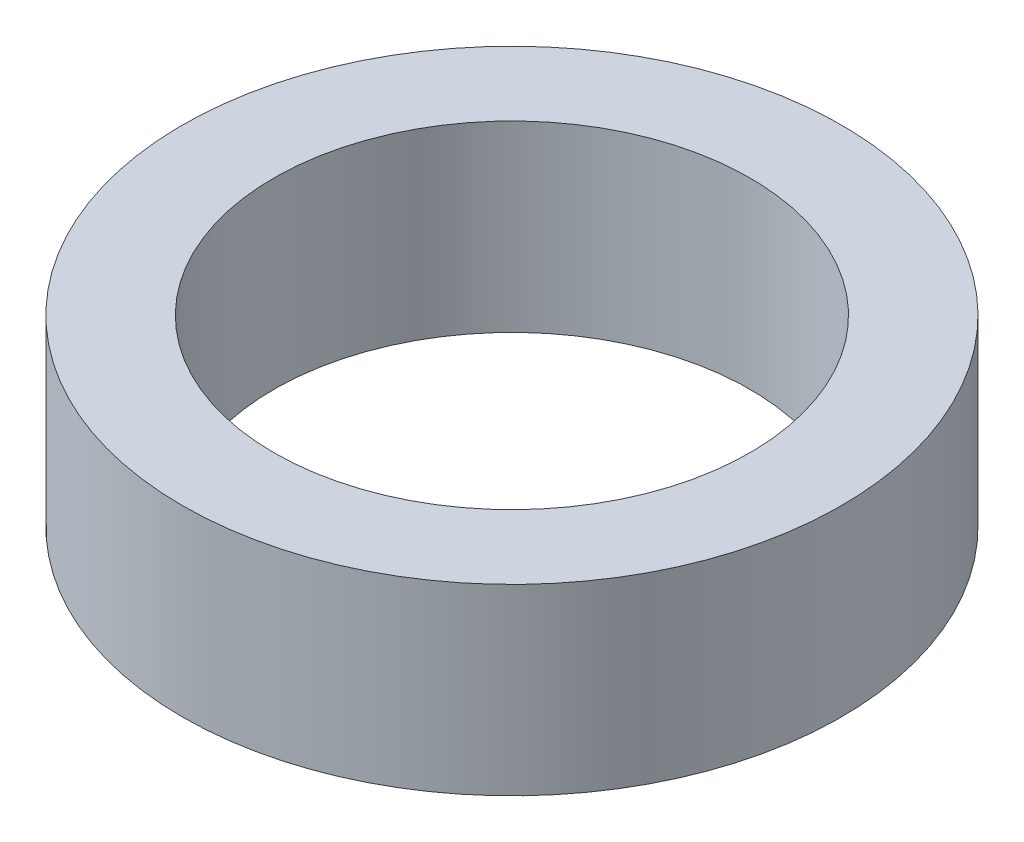
ISO-10303-21;
HEADER;
FILE_DESCRIPTION(('STEP AP214'),'2;1');
FILE_NAME('part.step','',(''),(''),'','','');
FILE_SCHEMA(('AUTOMOTIVE_DESIGN { 1 0 10303 214 1 1 1 1 }'));
ENDSEC;
DATA;
#1=APPLICATION_CONTEXT('core data for automotive mechanical design processes');
#2=APPLICATION_PROTOCOL_DEFINITION('international standard','automotive_design',2000,#1);
#3=PRODUCT_CONTEXT('',#1,'mechanical');
#4=PRODUCT('Part','Part','',(#3));
#5=PRODUCT_RELATED_PRODUCT_CATEGORY('part','',(#4));
#6=PRODUCT_DEFINITION_FORMATION('','',#4);
#7=PRODUCT_DEFINITION_CONTEXT('part definition',#1,'design');
#8=PRODUCT_DEFINITION('design','',#6,#7);
#9=PRODUCT_DEFINITION_SHAPE('','',#8);
#10=(LENGTH_UNIT() NAMED_UNIT(*) SI_UNIT(.MILLI.,.METRE.));
#11=(NAMED_UNIT(*) PLANE_ANGLE_UNIT() SI_UNIT($,.RADIAN.));
#12=(NAMED_UNIT(*) SI_UNIT($,.STERADIAN.) SOLID_ANGLE_UNIT());
#13=UNCERTAINTY_MEASURE_WITH_UNIT(LENGTH_MEASURE(1.E-05),#10,'distance_accuracy_value','');
#14=(GEOMETRIC_REPRESENTATION_CONTEXT(3) GLOBAL_UNCERTAINTY_ASSIGNED_CONTEXT((#13)) GLOBAL_UNIT_ASSIGNED_CONTEXT((#10,
#11,#12)) REPRESENTATION_CONTEXT('',''));
#15=CARTESIAN_POINT('',(0.,0.,0.));
#16=DIRECTION('',(0.,0.,1.));
#17=DIRECTION('',(1.,0.,0.));
#18=AXIS2_PLACEMENT_3D('',#15,#16,#17);
#19=CARTESIAN_POINT('',(0.,5.,0.));
#20=DIRECTION('',(0.,1.,0.));
#21=DIRECTION('',(0.,0.,1.));
#22=AXIS2_PLACEMENT_3D('',#19,#20,#21);
#23=PLANE('',#22);
#24=CARTESIAN_POINT('',(0.,5.,0.));
#25=DIRECTION('',(0.,1.,0.));
#26=DIRECTION('',(0.,0.,1.));
#27=AXIS2_PLACEMENT_3D('',#24,#25,#26);
#28=CIRCLE('',#27,9.);
#29=CARTESIAN_POINT('',(0.,5.,9.));
#30=VERTEX_POINT('',#29);
#31=EDGE_CURVE('E10',#30,#30,#28,.T.);
#32=ORIENTED_EDGE('',*,*,#31,.T.);
#33=EDGE_LOOP('',(#32));
#34=FACE_BOUND('',#33,.T.);
#35=CARTESIAN_POINT('',(0.,5.,0.));
#36=DIRECTION('',(0.,1.,0.));
#37=DIRECTION('',(0.,0.,1.));
#38=AXIS2_PLACEMENT_3D('',#35,#36,#37);
#39=CIRCLE('',#38,6.5);
#40=CARTESIAN_POINT('',(0.,5.,6.5));
#41=VERTEX_POINT('',#40);
#42=EDGE_CURVE('E42',#41,#41,#39,.T.);
#43=ORIENTED_EDGE('',*,*,#42,.F.);
#44=EDGE_LOOP('',(#43));
#45=FACE_BOUND('',#44,.T.);
#46=ADVANCED_FACE('F31',(#34,#45),#23,.T.);
#47=CARTESIAN_POINT('',(0.,0.,0.));
#48=DIRECTION('',(0.,1.,0.));
#49=DIRECTION('',(0.,0.,1.));
#50=AXIS2_PLACEMENT_3D('',#47,#48,#49);
#51=PLANE('',#50);
#52=CARTESIAN_POINT('',(0.,0.,0.));
#53=DIRECTION('',(0.,1.,0.));
#54=DIRECTION('',(0.,0.,1.));
#55=AXIS2_PLACEMENT_3D('',#52,#53,#54);
#56=CIRCLE('',#55,9.);
#57=CARTESIAN_POINT('',(0.,0.,9.));
#58=VERTEX_POINT('',#57);
#59=EDGE_CURVE('E35',#58,#58,#56,.T.);
#60=ORIENTED_EDGE('',*,*,#59,.F.);
#61=EDGE_LOOP('',(#60));
#62=FACE_BOUND('',#61,.T.);
#63=CARTESIAN_POINT('',(0.,0.,0.));
#64=DIRECTION('',(0.,1.,0.));
#65=DIRECTION('',(0.,0.,1.));
#66=AXIS2_PLACEMENT_3D('',#63,#64,#65);
#67=CIRCLE('',#66,6.5);
#68=CARTESIAN_POINT('',(0.,0.,6.5));
#69=VERTEX_POINT('',#68);
#70=EDGE_CURVE('E44',#69,#69,#67,.T.);
#71=ORIENTED_EDGE('',*,*,#70,.T.);
#72=EDGE_LOOP('',(#71));
#73=FACE_BOUND('',#72,.T.);
#74=ADVANCED_FACE('F54',(#62,#73),#51,.F.);
#75=CARTESIAN_POINT('',(0.,5.,0.));
#76=DIRECTION('',(0.,-1.,0.));
#77=DIRECTION('',(0.,0.,-1.));
#78=AXIS2_PLACEMENT_3D('',#75,#76,#77);
#79=CYLINDRICAL_SURFACE('',#78,9.);
#80=ORIENTED_EDGE('',*,*,#31,.F.);
#81=EDGE_LOOP('',(#80));
#82=FACE_BOUND('',#81,.T.);
#83=ORIENTED_EDGE('',*,*,#59,.T.);
#84=EDGE_LOOP('',(#83));
#85=FACE_BOUND('',#84,.T.);
#86=ADVANCED_FACE('F33',(#82,#85),#79,.T.);
#87=CARTESIAN_POINT('',(0.,5.,0.));
#88=DIRECTION('',(0.,-1.,0.));
#89=DIRECTION('',(0.,0.,-1.));
#90=AXIS2_PLACEMENT_3D('',#87,#88,#89);
#91=CYLINDRICAL_SURFACE('',#90,6.5);
#92=ORIENTED_EDGE('',*,*,#42,.T.);
#93=EDGE_LOOP('',(#92));
#94=FACE_BOUND('',#93,.T.);
#95=ORIENTED_EDGE('',*,*,#70,.F.);
#96=EDGE_LOOP('',(#95));
#97=FACE_BOUND('',#96,.T.);
#98=ADVANCED_FACE('F50',(#94,#97),#91,.F.);
#99=CLOSED_SHELL('',(#46,#74,#86,#98));
#100=MANIFOLD_SOLID_BREP('B2',#99);
#101=ADVANCED_BREP_SHAPE_REPRESENTATION('',(#18,#100),#14);
#102=SHAPE_DEFINITION_REPRESENTATION(#9,#101);
ENDSEC;
END-ISO-10303-21;
